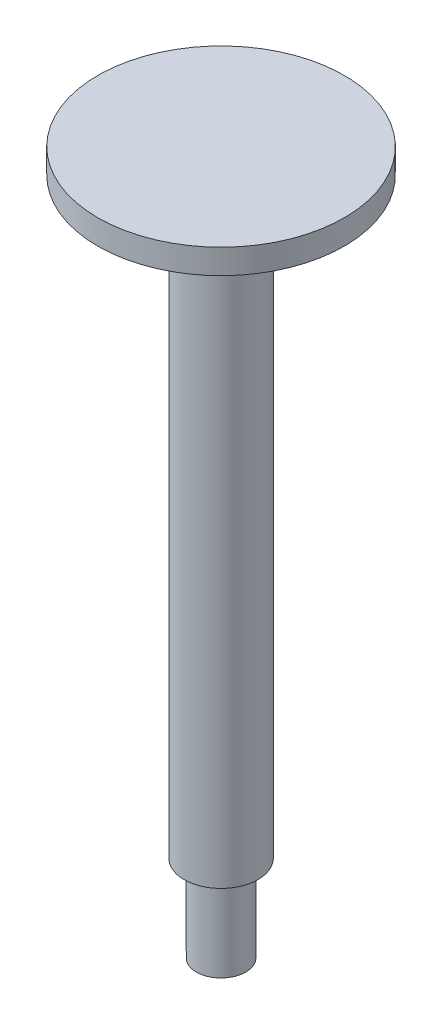
ISO-10303-21;
HEADER;
FILE_DESCRIPTION(('STEP AP214'),'2;1');
FILE_NAME('part.step','',(''),(''),'','','');
FILE_SCHEMA(('AUTOMOTIVE_DESIGN { 1 0 10303 214 1 1 1 1 }'));
ENDSEC;
DATA;
#1=APPLICATION_CONTEXT('core data for automotive mechanical design processes');
#2=APPLICATION_PROTOCOL_DEFINITION('international standard','automotive_design',2000,#1);
#3=PRODUCT_CONTEXT('',#1,'mechanical');
#4=PRODUCT('Part','Part','',(#3));
#5=PRODUCT_RELATED_PRODUCT_CATEGORY('part','',(#4));
#6=PRODUCT_DEFINITION_FORMATION('','',#4);
#7=PRODUCT_DEFINITION_CONTEXT('part definition',#1,'design');
#8=PRODUCT_DEFINITION('design','',#6,#7);
#9=PRODUCT_DEFINITION_SHAPE('','',#8);
#10=(LENGTH_UNIT() NAMED_UNIT(*) SI_UNIT(.MILLI.,.METRE.));
#11=(NAMED_UNIT(*) PLANE_ANGLE_UNIT() SI_UNIT($,.RADIAN.));
#12=(NAMED_UNIT(*) SI_UNIT($,.STERADIAN.) SOLID_ANGLE_UNIT());
#13=UNCERTAINTY_MEASURE_WITH_UNIT(LENGTH_MEASURE(1.E-05),#10,'distance_accuracy_value','');
#14=(GEOMETRIC_REPRESENTATION_CONTEXT(3) GLOBAL_UNCERTAINTY_ASSIGNED_CONTEXT((#13)) GLOBAL_UNIT_ASSIGNED_CONTEXT((#10,
#11,#12)) REPRESENTATION_CONTEXT('',''));
#15=CARTESIAN_POINT('',(0.,0.,0.));
#16=DIRECTION('',(0.,0.,1.));
#17=DIRECTION('',(1.,0.,0.));
#18=AXIS2_PLACEMENT_3D('',#15,#16,#17);
#19=CARTESIAN_POINT('',(0.,0.,0.));
#20=DIRECTION('',(0.,1.,0.));
#21=DIRECTION('',(0.,0.,1.));
#22=AXIS2_PLACEMENT_3D('',#19,#20,#21);
#23=PLANE('',#22);
#24=CARTESIAN_POINT('',(0.,0.,0.));
#25=DIRECTION('',(0.,1.,0.));
#26=DIRECTION('',(0.,0.,1.));
#27=AXIS2_PLACEMENT_3D('',#24,#25,#26);
#28=CIRCLE('',#27,3.);
#29=CARTESIAN_POINT('',(0.,0.,3.));
#30=VERTEX_POINT('',#29);
#31=EDGE_CURVE('E59',#30,#30,#28,.T.);
#32=ORIENTED_EDGE('',*,*,#31,.F.);
#33=EDGE_LOOP('',(#32));
#34=FACE_BOUND('',#33,.T.);
#35=CARTESIAN_POINT('',(0.,0.,0.));
#36=DIRECTION('',(0.,1.,0.));
#37=DIRECTION('',(0.,0.,1.));
#38=AXIS2_PLACEMENT_3D('',#35,#36,#37);
#39=CIRCLE('',#38,2.);
#40=CARTESIAN_POINT('',(0.,0.,2.));
#41=VERTEX_POINT('',#40);
#42=EDGE_CURVE('E12',#41,#41,#39,.F.);
#43=ORIENTED_EDGE('',*,*,#42,.F.);
#44=EDGE_LOOP('',(#43));
#45=FACE_BOUND('',#44,.T.);
#46=ADVANCED_FACE('F48',(#34,#45),#23,.F.);
#47=CARTESIAN_POINT('',(0.,48.,0.));
#48=DIRECTION('',(0.,-1.,0.));
#49=DIRECTION('',(0.,0.,-1.));
#50=AXIS2_PLACEMENT_3D('',#47,#48,#49);
#51=CYLINDRICAL_SURFACE('',#50,3.);
#52=CARTESIAN_POINT('',(0.,48.,0.));
#53=DIRECTION('',(0.,1.,0.));
#54=DIRECTION('',(0.,0.,1.));
#55=AXIS2_PLACEMENT_3D('',#52,#53,#54);
#56=CIRCLE('',#55,3.);
#57=CARTESIAN_POINT('',(0.,48.,3.));
#58=VERTEX_POINT('',#57);
#59=EDGE_CURVE('E55',#58,#58,#56,.T.);
#60=ORIENTED_EDGE('',*,*,#59,.F.);
#61=EDGE_LOOP('',(#60));
#62=FACE_BOUND('',#61,.T.);
#63=ORIENTED_EDGE('',*,*,#31,.T.);
#64=EDGE_LOOP('',(#63));
#65=FACE_BOUND('',#64,.T.);
#66=ADVANCED_FACE('F50',(#62,#65),#51,.T.);
#67=CARTESIAN_POINT('',(0.,48.,0.));
#68=DIRECTION('',(0.,1.,0.));
#69=DIRECTION('',(0.,0.,1.));
#70=AXIS2_PLACEMENT_3D('',#67,#68,#69);
#71=PLANE('',#70);
#72=CARTESIAN_POINT('',(0.,48.,0.));
#73=DIRECTION('',(0.,1.,0.));
#74=DIRECTION('',(0.,0.,1.));
#75=AXIS2_PLACEMENT_3D('',#72,#73,#74);
#76=CIRCLE('',#75,10.);
#77=CARTESIAN_POINT('',(0.,48.,10.));
#78=VERTEX_POINT('',#77);
#79=EDGE_CURVE('E66',#78,#78,#76,.T.);
#80=ORIENTED_EDGE('',*,*,#79,.F.);
#81=EDGE_LOOP('',(#80));
#82=FACE_BOUND('',#81,.T.);
#83=ORIENTED_EDGE('',*,*,#59,.T.);
#84=EDGE_LOOP('',(#83));
#85=FACE_BOUND('',#84,.T.);
#86=ADVANCED_FACE('F94',(#82,#85),#71,.F.);
#87=CARTESIAN_POINT('',(0.,50.,0.));
#88=DIRECTION('',(0.,-1.,0.));
#89=DIRECTION('',(0.,0.,-1.));
#90=AXIS2_PLACEMENT_3D('',#87,#88,#89);
#91=CYLINDRICAL_SURFACE('',#90,10.);
#92=CARTESIAN_POINT('',(0.,50.,0.));
#93=DIRECTION('',(0.,1.,0.));
#94=DIRECTION('',(0.,0.,1.));
#95=AXIS2_PLACEMENT_3D('',#92,#93,#94);
#96=CIRCLE('',#95,10.);
#97=CARTESIAN_POINT('',(0.,50.,10.));
#98=VERTEX_POINT('',#97);
#99=EDGE_CURVE('E64',#98,#98,#96,.T.);
#100=ORIENTED_EDGE('',*,*,#99,.F.);
#101=EDGE_LOOP('',(#100));
#102=FACE_BOUND('',#101,.T.);
#103=ORIENTED_EDGE('',*,*,#79,.T.);
#104=EDGE_LOOP('',(#103));
#105=FACE_BOUND('',#104,.T.);
#106=ADVANCED_FACE('F86',(#102,#105),#91,.T.);
#107=CARTESIAN_POINT('',(0.,50.,0.));
#108=DIRECTION('',(0.,1.,0.));
#109=DIRECTION('',(0.,0.,1.));
#110=AXIS2_PLACEMENT_3D('',#107,#108,#109);
#111=PLANE('',#110);
#112=ORIENTED_EDGE('',*,*,#99,.T.);
#113=EDGE_LOOP('',(#112));
#114=FACE_BOUND('',#113,.T.);
#115=ADVANCED_FACE('F79',(#114),#111,.T.);
#116=CARTESIAN_POINT('',(0.,-7.,0.));
#117=DIRECTION('',(0.,1.,0.));
#118=DIRECTION('',(0.,0.,1.));
#119=AXIS2_PLACEMENT_3D('',#116,#117,#118);
#120=CYLINDRICAL_SURFACE('',#119,2.);
#121=CARTESIAN_POINT('',(0.,-7.,0.));
#122=DIRECTION('',(0.,-1.,0.));
#123=DIRECTION('',(0.,0.,-1.));
#124=AXIS2_PLACEMENT_3D('',#121,#122,#123);
#125=CIRCLE('',#124,2.);
#126=CARTESIAN_POINT('',(0.,-7.,-2.));
#127=VERTEX_POINT('',#126);
#128=EDGE_CURVE('E69',#127,#127,#125,.T.);
#129=ORIENTED_EDGE('',*,*,#128,.F.);
#130=EDGE_LOOP('',(#129));
#131=FACE_BOUND('',#130,.T.);
#132=ORIENTED_EDGE('',*,*,#42,.T.);
#133=EDGE_LOOP('',(#132));
#134=FACE_BOUND('',#133,.T.);
#135=ADVANCED_FACE('F77',(#131,#134),#120,.T.);
#136=CARTESIAN_POINT('',(0.,-7.,0.));
#137=DIRECTION('',(0.,-1.,0.));
#138=DIRECTION('',(0.,0.,-1.));
#139=AXIS2_PLACEMENT_3D('',#136,#137,#138);
#140=PLANE('',#139);
#141=ORIENTED_EDGE('',*,*,#128,.T.);
#142=EDGE_LOOP('',(#141));
#143=FACE_BOUND('',#142,.T.);
#144=ADVANCED_FACE('F75',(#143),#140,.T.);
#145=CLOSED_SHELL('',(#46,#66,#86,#106,#115,#135,#144));
#146=MANIFOLD_SOLID_BREP('B2',#145);
#147=ADVANCED_BREP_SHAPE_REPRESENTATION('',(#18,#146),#14);
#148=SHAPE_DEFINITION_REPRESENTATION(#9,#147);
ENDSEC;
END-ISO-10303-21;
